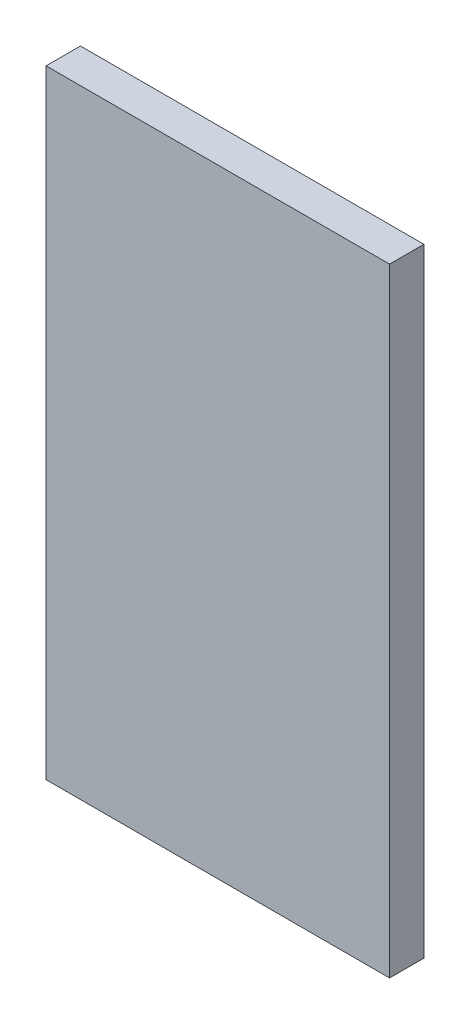
ISO-10303-21;
HEADER;
FILE_DESCRIPTION(('STEP AP214'),'2;1');
FILE_NAME('part.step','',(''),(''),'','','');
FILE_SCHEMA(('AUTOMOTIVE_DESIGN { 1 0 10303 214 1 1 1 1 }'));
ENDSEC;
DATA;
#1=APPLICATION_CONTEXT('core data for automotive mechanical design processes');
#2=APPLICATION_PROTOCOL_DEFINITION('international standard','automotive_design',2000,#1);
#3=PRODUCT_CONTEXT('',#1,'mechanical');
#4=PRODUCT('Part','Part','',(#3));
#5=PRODUCT_RELATED_PRODUCT_CATEGORY('part','',(#4));
#6=PRODUCT_DEFINITION_FORMATION('','',#4);
#7=PRODUCT_DEFINITION_CONTEXT('part definition',#1,'design');
#8=PRODUCT_DEFINITION('design','',#6,#7);
#9=PRODUCT_DEFINITION_SHAPE('','',#8);
#10=(LENGTH_UNIT() NAMED_UNIT(*) SI_UNIT(.MILLI.,.METRE.));
#11=(NAMED_UNIT(*) PLANE_ANGLE_UNIT() SI_UNIT($,.RADIAN.));
#12=(NAMED_UNIT(*) SI_UNIT($,.STERADIAN.) SOLID_ANGLE_UNIT());
#13=UNCERTAINTY_MEASURE_WITH_UNIT(LENGTH_MEASURE(1.E-05),#10,'distance_accuracy_value','');
#14=(GEOMETRIC_REPRESENTATION_CONTEXT(3) GLOBAL_UNCERTAINTY_ASSIGNED_CONTEXT((#13)) GLOBAL_UNIT_ASSIGNED_CONTEXT((#10,
#11,#12)) REPRESENTATION_CONTEXT('',''));
#15=CARTESIAN_POINT('',(0.,0.,0.));
#16=DIRECTION('',(0.,0.,1.));
#17=DIRECTION('',(1.,0.,0.));
#18=AXIS2_PLACEMENT_3D('',#15,#16,#17);
#19=CARTESIAN_POINT('',(100.,0.,10.));
#20=DIRECTION('',(0.,1.,0.));
#21=DIRECTION('',(-1.,0.,0.));
#22=AXIS2_PLACEMENT_3D('',#19,#20,#21);
#23=PLANE('',#22);
#24=DIRECTION('',(1.,0.,0.));
#25=VECTOR('',#24,1.);
#26=CARTESIAN_POINT('',(100.,0.,0.));
#27=LINE('',#26,#25);
#28=CARTESIAN_POINT('',(0.,0.,0.));
#29=VERTEX_POINT('',#28);
#30=CARTESIAN_POINT('',(100.,0.,0.));
#31=VERTEX_POINT('',#30);
#32=EDGE_CURVE('E113',#29,#31,#27,.T.);
#33=ORIENTED_EDGE('',*,*,#32,.T.);
#34=DIRECTION('',(0.,0.,-1.));
#35=VECTOR('',#34,1.);
#36=CARTESIAN_POINT('',(100.,0.,10.));
#37=LINE('',#36,#35);
#38=CARTESIAN_POINT('',(100.,0.,10.));
#39=VERTEX_POINT('',#38);
#40=EDGE_CURVE('E11',#39,#31,#37,.T.);
#41=ORIENTED_EDGE('',*,*,#40,.F.);
#42=DIRECTION('',(1.,0.,0.));
#43=VECTOR('',#42,1.);
#44=CARTESIAN_POINT('',(100.,0.,10.));
#45=LINE('',#44,#43);
#46=CARTESIAN_POINT('',(0.,0.,10.));
#47=VERTEX_POINT('',#46);
#48=EDGE_CURVE('E97',#47,#39,#45,.T.);
#49=ORIENTED_EDGE('',*,*,#48,.F.);
#50=DIRECTION('',(0.,0.,-1.));
#51=VECTOR('',#50,1.);
#52=CARTESIAN_POINT('',(0.,0.,10.));
#53=LINE('',#52,#51);
#54=EDGE_CURVE('E109',#47,#29,#53,.T.);
#55=ORIENTED_EDGE('',*,*,#54,.T.);
#56=EDGE_LOOP('',(#33,#41,#49,#55));
#57=FACE_BOUND('',#56,.T.);
#58=ADVANCED_FACE('F45',(#57),#23,.F.);
#59=CARTESIAN_POINT('',(100.,180.,10.));
#60=DIRECTION('',(-1.,0.,0.));
#61=DIRECTION('',(0.,-1.,0.));
#62=AXIS2_PLACEMENT_3D('',#59,#60,#61);
#63=PLANE('',#62);
#64=DIRECTION('',(0.,1.,0.));
#65=VECTOR('',#64,1.);
#66=CARTESIAN_POINT('',(100.,180.,0.));
#67=LINE('',#66,#65);
#68=CARTESIAN_POINT('',(100.,180.,0.));
#69=VERTEX_POINT('',#68);
#70=EDGE_CURVE('E102',#31,#69,#67,.T.);
#71=ORIENTED_EDGE('',*,*,#70,.T.);
#72=DIRECTION('',(0.,0.,-1.));
#73=VECTOR('',#72,1.);
#74=CARTESIAN_POINT('',(100.,180.,10.));
#75=LINE('',#74,#73);
#76=CARTESIAN_POINT('',(100.,180.,10.));
#77=VERTEX_POINT('',#76);
#78=EDGE_CURVE('E54',#77,#69,#75,.T.);
#79=ORIENTED_EDGE('',*,*,#78,.F.);
#80=DIRECTION('',(0.,1.,0.));
#81=VECTOR('',#80,1.);
#82=CARTESIAN_POINT('',(100.,180.,10.));
#83=LINE('',#82,#81);
#84=EDGE_CURVE('E92',#39,#77,#83,.T.);
#85=ORIENTED_EDGE('',*,*,#84,.F.);
#86=ORIENTED_EDGE('',*,*,#40,.T.);
#87=EDGE_LOOP('',(#71,#79,#85,#86));
#88=FACE_BOUND('',#87,.T.);
#89=ADVANCED_FACE('F101',(#88),#63,.F.);
#90=CARTESIAN_POINT('',(0.,180.,10.));
#91=DIRECTION('',(0.,-1.,0.));
#92=DIRECTION('',(0.,0.,-1.));
#93=AXIS2_PLACEMENT_3D('',#90,#91,#92);
#94=PLANE('',#93);
#95=DIRECTION('',(-1.,0.,0.));
#96=VECTOR('',#95,1.);
#97=CARTESIAN_POINT('',(0.,180.,0.));
#98=LINE('',#97,#96);
#99=CARTESIAN_POINT('',(0.,180.,0.));
#100=VERTEX_POINT('',#99);
#101=EDGE_CURVE('E79',#69,#100,#98,.T.);
#102=ORIENTED_EDGE('',*,*,#101,.T.);
#103=DIRECTION('',(0.,0.,-1.));
#104=VECTOR('',#103,1.);
#105=CARTESIAN_POINT('',(0.,180.,10.));
#106=LINE('',#105,#104);
#107=CARTESIAN_POINT('',(0.,180.,10.));
#108=VERTEX_POINT('',#107);
#109=EDGE_CURVE('E104',#108,#100,#106,.T.);
#110=ORIENTED_EDGE('',*,*,#109,.F.);
#111=DIRECTION('',(-1.,0.,0.));
#112=VECTOR('',#111,1.);
#113=CARTESIAN_POINT('',(0.,180.,10.));
#114=LINE('',#113,#112);
#115=EDGE_CURVE('E95',#77,#108,#114,.T.);
#116=ORIENTED_EDGE('',*,*,#115,.F.);
#117=ORIENTED_EDGE('',*,*,#78,.T.);
#118=EDGE_LOOP('',(#102,#110,#116,#117));
#119=FACE_BOUND('',#118,.T.);
#120=ADVANCED_FACE('F105',(#119),#94,.F.);
#121=CARTESIAN_POINT('',(0.,0.,10.));
#122=DIRECTION('',(1.,0.,0.));
#123=DIRECTION('',(0.,0.,-1.));
#124=AXIS2_PLACEMENT_3D('',#121,#122,#123);
#125=PLANE('',#124);
#126=DIRECTION('',(0.,-1.,0.));
#127=VECTOR('',#126,1.);
#128=CARTESIAN_POINT('',(0.,0.,0.));
#129=LINE('',#128,#127);
#130=EDGE_CURVE('E85',#100,#29,#129,.T.);
#131=ORIENTED_EDGE('',*,*,#130,.T.);
#132=ORIENTED_EDGE('',*,*,#54,.F.);
#133=DIRECTION('',(0.,-1.,0.));
#134=VECTOR('',#133,1.);
#135=CARTESIAN_POINT('',(0.,0.,10.));
#136=LINE('',#135,#134);
#137=EDGE_CURVE('E62',#108,#47,#136,.T.);
#138=ORIENTED_EDGE('',*,*,#137,.F.);
#139=ORIENTED_EDGE('',*,*,#109,.T.);
#140=EDGE_LOOP('',(#131,#132,#138,#139));
#141=FACE_BOUND('',#140,.T.);
#142=ADVANCED_FACE('F126',(#141),#125,.F.);
#143=CARTESIAN_POINT('',(0.,0.,10.));
#144=DIRECTION('',(0.,0.,-1.));
#145=DIRECTION('',(-1.,0.,0.));
#146=AXIS2_PLACEMENT_3D('',#143,#144,#145);
#147=PLANE('',#146);
#148=ORIENTED_EDGE('',*,*,#48,.T.);
#149=ORIENTED_EDGE('',*,*,#84,.T.);
#150=ORIENTED_EDGE('',*,*,#115,.T.);
#151=ORIENTED_EDGE('',*,*,#137,.T.);
#152=EDGE_LOOP('',(#148,#149,#150,#151));
#153=FACE_BOUND('',#152,.T.);
#154=ADVANCED_FACE('F93',(#153),#147,.F.);
#155=CARTESIAN_POINT('',(0.,0.,0.));
#156=DIRECTION('',(0.,0.,-1.));
#157=DIRECTION('',(-1.,0.,0.));
#158=AXIS2_PLACEMENT_3D('',#155,#156,#157);
#159=PLANE('',#158);
#160=ORIENTED_EDGE('',*,*,#32,.F.);
#161=ORIENTED_EDGE('',*,*,#130,.F.);
#162=ORIENTED_EDGE('',*,*,#101,.F.);
#163=ORIENTED_EDGE('',*,*,#70,.F.);
#164=EDGE_LOOP('',(#160,#161,#162,#163));
#165=FACE_BOUND('',#164,.T.);
#166=ADVANCED_FACE('F129',(#165),#159,.T.);
#167=CLOSED_SHELL('',(#58,#89,#120,#142,#154,#166));
#168=MANIFOLD_SOLID_BREP('B2',#167);
#169=ADVANCED_BREP_SHAPE_REPRESENTATION('',(#18,#168),#14);
#170=SHAPE_DEFINITION_REPRESENTATION(#9,#169);
ENDSEC;
END-ISO-10303-21;
